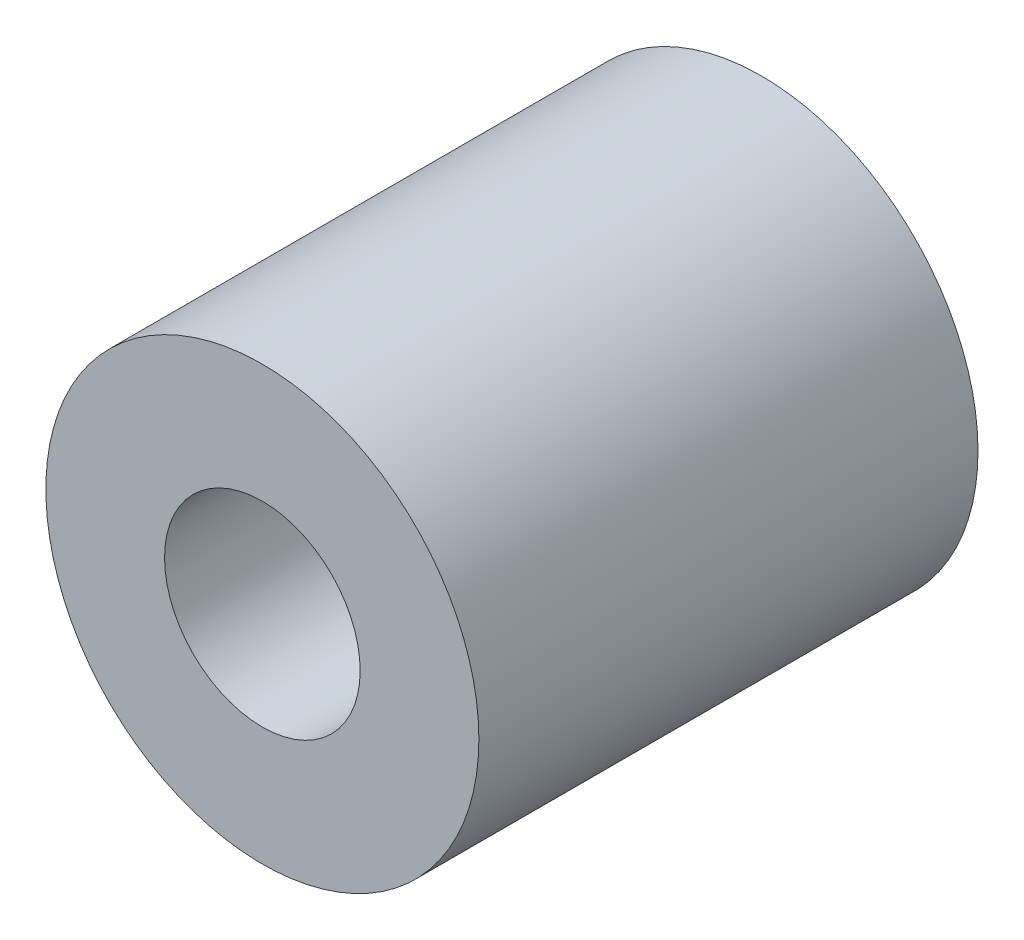
ISO-10303-21;
HEADER;
FILE_DESCRIPTION(('STEP AP214'),'2;1');
FILE_NAME('part.step','',(''),(''),'','','');
FILE_SCHEMA(('AUTOMOTIVE_DESIGN { 1 0 10303 214 1 1 1 1 }'));
ENDSEC;
DATA;
#1=APPLICATION_CONTEXT('core data for automotive mechanical design processes');
#2=APPLICATION_PROTOCOL_DEFINITION('international standard','automotive_design',2000,#1);
#3=PRODUCT_CONTEXT('',#1,'mechanical');
#4=PRODUCT('Part','Part','',(#3));
#5=PRODUCT_RELATED_PRODUCT_CATEGORY('part','',(#4));
#6=PRODUCT_DEFINITION_FORMATION('','',#4);
#7=PRODUCT_DEFINITION_CONTEXT('part definition',#1,'design');
#8=PRODUCT_DEFINITION('design','',#6,#7);
#9=PRODUCT_DEFINITION_SHAPE('','',#8);
#10=(LENGTH_UNIT() NAMED_UNIT(*) SI_UNIT(.MILLI.,.METRE.));
#11=(NAMED_UNIT(*) PLANE_ANGLE_UNIT() SI_UNIT($,.RADIAN.));
#12=(NAMED_UNIT(*) SI_UNIT($,.STERADIAN.) SOLID_ANGLE_UNIT());
#13=UNCERTAINTY_MEASURE_WITH_UNIT(LENGTH_MEASURE(1.E-05),#10,'distance_accuracy_value','');
#14=(GEOMETRIC_REPRESENTATION_CONTEXT(3) GLOBAL_UNCERTAINTY_ASSIGNED_CONTEXT((#13)) GLOBAL_UNIT_ASSIGNED_CONTEXT((#10,
#11,#12)) REPRESENTATION_CONTEXT('',''));
#15=CARTESIAN_POINT('',(0.,0.,0.));
#16=DIRECTION('',(0.,0.,1.));
#17=DIRECTION('',(1.,0.,0.));
#18=AXIS2_PLACEMENT_3D('',#15,#16,#17);
#19=CARTESIAN_POINT('',(0.,0.,13.349986));
#20=DIRECTION('',(0.,0.,1.));
#21=DIRECTION('',(1.,0.,0.));
#22=AXIS2_PLACEMENT_3D('',#19,#20,#21);
#23=PLANE('',#22);
#24=CARTESIAN_POINT('',(0.,0.,13.349986));
#25=DIRECTION('',(0.,0.,1.));
#26=DIRECTION('',(1.,0.,0.));
#27=AXIS2_PLACEMENT_3D('',#24,#25,#26);
#28=CIRCLE('',#27,5.7912);
#29=CARTESIAN_POINT('',(5.7912,0.,13.349986));
#30=VERTEX_POINT('',#29);
#31=EDGE_CURVE('E10',#30,#30,#28,.T.);
#32=ORIENTED_EDGE('',*,*,#31,.T.);
#33=EDGE_LOOP('',(#32));
#34=FACE_BOUND('',#33,.T.);
#35=CARTESIAN_POINT('',(0.,0.,13.349986));
#36=DIRECTION('',(0.,0.,1.));
#37=DIRECTION('',(1.,0.,0.));
#38=AXIS2_PLACEMENT_3D('',#35,#36,#37);
#39=CIRCLE('',#38,2.6162);
#40=CARTESIAN_POINT('',(2.6162,0.,13.349986));
#41=VERTEX_POINT('',#40);
#42=EDGE_CURVE('E52',#41,#41,#39,.T.);
#43=ORIENTED_EDGE('',*,*,#42,.F.);
#44=EDGE_LOOP('',(#43));
#45=FACE_BOUND('',#44,.T.);
#46=ADVANCED_FACE('F41',(#34,#45),#23,.T.);
#47=CARTESIAN_POINT('',(0.,0.,0.));
#48=DIRECTION('',(0.,0.,1.));
#49=DIRECTION('',(1.,0.,0.));
#50=AXIS2_PLACEMENT_3D('',#47,#48,#49);
#51=PLANE('',#50);
#52=CARTESIAN_POINT('',(0.,0.,0.));
#53=DIRECTION('',(0.,0.,1.));
#54=DIRECTION('',(1.,0.,0.));
#55=AXIS2_PLACEMENT_3D('',#52,#53,#54);
#56=CIRCLE('',#55,5.7912);
#57=CARTESIAN_POINT('',(5.7912,0.,0.));
#58=VERTEX_POINT('',#57);
#59=EDGE_CURVE('E45',#58,#58,#56,.T.);
#60=ORIENTED_EDGE('',*,*,#59,.F.);
#61=EDGE_LOOP('',(#60));
#62=FACE_BOUND('',#61,.T.);
#63=CARTESIAN_POINT('',(0.,0.,0.));
#64=DIRECTION('',(0.,0.,1.));
#65=DIRECTION('',(1.,0.,0.));
#66=AXIS2_PLACEMENT_3D('',#63,#64,#65);
#67=CIRCLE('',#66,2.6162);
#68=CARTESIAN_POINT('',(2.6162,0.,0.));
#69=VERTEX_POINT('',#68);
#70=EDGE_CURVE('E54',#69,#69,#67,.T.);
#71=ORIENTED_EDGE('',*,*,#70,.T.);
#72=EDGE_LOOP('',(#71));
#73=FACE_BOUND('',#72,.T.);
#74=ADVANCED_FACE('F64',(#62,#73),#51,.F.);
#75=CARTESIAN_POINT('',(0.,0.,13.349986));
#76=DIRECTION('',(0.,0.,-1.));
#77=DIRECTION('',(-1.,0.,0.));
#78=AXIS2_PLACEMENT_3D('',#75,#76,#77);
#79=CYLINDRICAL_SURFACE('',#78,5.7912);
#80=ORIENTED_EDGE('',*,*,#31,.F.);
#81=EDGE_LOOP('',(#80));
#82=FACE_BOUND('',#81,.T.);
#83=ORIENTED_EDGE('',*,*,#59,.T.);
#84=EDGE_LOOP('',(#83));
#85=FACE_BOUND('',#84,.T.);
#86=ADVANCED_FACE('F43',(#82,#85),#79,.T.);
#87=CARTESIAN_POINT('',(0.,0.,13.349986));
#88=DIRECTION('',(0.,0.,-1.));
#89=DIRECTION('',(-1.,0.,0.));
#90=AXIS2_PLACEMENT_3D('',#87,#88,#89);
#91=CYLINDRICAL_SURFACE('',#90,2.6162);
#92=ORIENTED_EDGE('',*,*,#42,.T.);
#93=EDGE_LOOP('',(#92));
#94=FACE_BOUND('',#93,.T.);
#95=ORIENTED_EDGE('',*,*,#70,.F.);
#96=EDGE_LOOP('',(#95));
#97=FACE_BOUND('',#96,.T.);
#98=ADVANCED_FACE('F60',(#94,#97),#91,.F.);
#99=CLOSED_SHELL('',(#46,#74,#86,#98));
#100=MANIFOLD_SOLID_BREP('B2',#99);
#101=ADVANCED_BREP_SHAPE_REPRESENTATION('',(#18,#100),#14);
#102=SHAPE_DEFINITION_REPRESENTATION(#9,#101);
ENDSEC;
END-ISO-10303-21;
